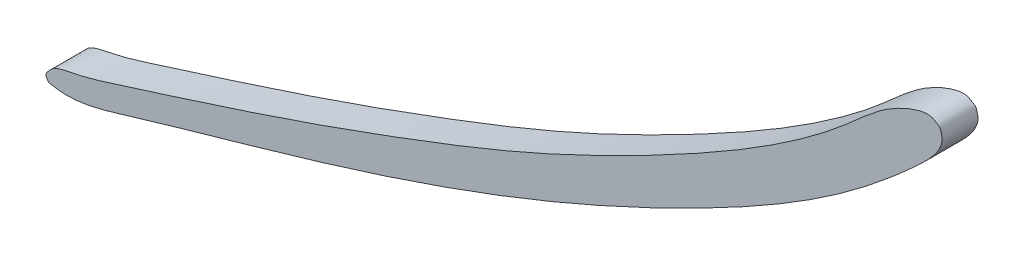
ISO-10303-21;
HEADER;
FILE_DESCRIPTION(('STEP AP214'),'2;1');
FILE_NAME('part.step','',(''),(''),'','','');
FILE_SCHEMA(('AUTOMOTIVE_DESIGN { 1 0 10303 214 1 1 1 1 }'));
ENDSEC;
DATA;
#1=APPLICATION_CONTEXT('core data for automotive mechanical design processes');
#2=APPLICATION_PROTOCOL_DEFINITION('international standard','automotive_design',2000,#1);
#3=PRODUCT_CONTEXT('',#1,'mechanical');
#4=PRODUCT('Part','Part','',(#3));
#5=PRODUCT_RELATED_PRODUCT_CATEGORY('part','',(#4));
#6=PRODUCT_DEFINITION_FORMATION('','',#4);
#7=PRODUCT_DEFINITION_CONTEXT('part definition',#1,'design');
#8=PRODUCT_DEFINITION('design','',#6,#7);
#9=PRODUCT_DEFINITION_SHAPE('','',#8);
#10=(LENGTH_UNIT() NAMED_UNIT(*) SI_UNIT(.MILLI.,.METRE.));
#11=(NAMED_UNIT(*) PLANE_ANGLE_UNIT() SI_UNIT($,.RADIAN.));
#12=(NAMED_UNIT(*) SI_UNIT($,.STERADIAN.) SOLID_ANGLE_UNIT());
#13=UNCERTAINTY_MEASURE_WITH_UNIT(LENGTH_MEASURE(1.E-05),#10,'distance_accuracy_value','');
#14=(GEOMETRIC_REPRESENTATION_CONTEXT(3) GLOBAL_UNCERTAINTY_ASSIGNED_CONTEXT((#13)) GLOBAL_UNIT_ASSIGNED_CONTEXT((#10,
#11,#12)) REPRESENTATION_CONTEXT('',''));
#15=CARTESIAN_POINT('',(0.,0.,0.));
#16=DIRECTION('',(0.,0.,1.));
#17=DIRECTION('',(1.,0.,0.));
#18=AXIS2_PLACEMENT_3D('',#15,#16,#17);
#19=CARTESIAN_POINT('',(100.856543420804,0.,172.));
#20=CARTESIAN_POINT('',(100.77983885836,0.126927841356701,172.));
#21=CARTESIAN_POINT('',(100.662596135674,0.21744927088755,172.));
#22=CARTESIAN_POINT('',(100.421790469726,0.383624526763214,172.));
#23=CARTESIAN_POINT('',(100.296402312574,0.458934114660203,172.));
#24=CARTESIAN_POINT('',(100.049023461196,0.614853969354855,172.));
#25=CARTESIAN_POINT('',(99.9267694917447,0.695053477457356,172.));
#26=CARTESIAN_POINT('',(99.6765463609155,0.846535723148802,172.));
#27=CARTESIAN_POINT('',(99.5487620730539,0.917895490540779,172.));
#28=CARTESIAN_POINT('',(99.2886789635635,1.04728674125018,172.));
#29=CARTESIAN_POINT('',(99.1560361495975,1.10534776351891,172.));
#30=CARTESIAN_POINT('',(98.8809264269111,1.19641310903551,172.));
#31=CARTESIAN_POINT('',(98.7377639809031,1.22998743975916,172.));
#32=CARTESIAN_POINT('',(98.3016755478108,1.29816745985561,172.));
#33=CARTESIAN_POINT('',(98.0112202649311,1.2999847946435,172.));
#34=CARTESIAN_POINT('',(97.4305761110491,1.2606173666907,172.));
#35=CARTESIAN_POINT('',(97.1395673937876,1.21817249886957,172.));
#36=CARTESIAN_POINT('',(96.5676742330208,1.11223534318413,172.));
#37=CARTESIAN_POINT('',(96.2852333542078,1.04816783547126,172.));
#38=CARTESIAN_POINT('',(95.4473326146076,0.826135912949858,172.));
#39=CARTESIAN_POINT('',(94.900682649969,0.640279671769097,172.));
#40=CARTESIAN_POINT('',(93.8187122240887,0.232698373667369,172.));
#41=CARTESIAN_POINT('',(93.2827796710361,0.00844900181067423,172.));
#42=CARTESIAN_POINT('',(92.2278809756486,-0.472778004879594,172.));
#43=CARTESIAN_POINT('',(91.7103982534995,-0.728216224010292,172.));
#44=CARTESIAN_POINT('',(90.1855364420016,-1.53556381374852,172.));
#45=CARTESIAN_POINT('',(89.2066960886628,-2.12992272240059,172.));
#46=CARTESIAN_POINT('',(86.3804827949016,-4.07707517051212,172.));
#47=CARTESIAN_POINT('',(84.635685343688,-5.58252853982007,172.));
#48=CARTESIAN_POINT('',(82.0405973767693,-7.87327891563485,172.));
#49=CARTESIAN_POINT('',(81.178136131406,-8.64064978052708,172.));
#50=CARTESIAN_POINT('',(79.4382099869104,-10.1532640842727,172.));
#51=CARTESIAN_POINT('',(78.562333619962,-10.9008502943569,172.));
#52=CARTESIAN_POINT('',(75.9036488131683,-13.0978078919392,172.));
#53=CARTESIAN_POINT('',(74.0887673014303,-14.4998778329317,172.));
#54=CARTESIAN_POINT('',(70.4019052464715,-17.2198079207241,172.));
#55=CARTESIAN_POINT('',(68.5302941006086,-18.5382128556698,172.));
#56=CARTESIAN_POINT('',(64.745535473302,-21.1137648341413,172.));
#57=CARTESIAN_POINT('',(62.8317535095197,-22.3699761415299,172.));
#58=CARTESIAN_POINT('',(58.961311457863,-24.8191619918406,172.));
#59=CARTESIAN_POINT('',(57.0051855637663,-26.0129243650796,172.));
#60=CARTESIAN_POINT('',(53.0599506005538,-28.3518054426891,172.));
#61=CARTESIAN_POINT('',(51.0709062628974,-29.4970196131776,172.));
#62=CARTESIAN_POINT('',(47.0691759951991,-31.7525812746772,172.));
#63=CARTESIAN_POINT('',(45.0563989372152,-32.8627943699723,172.));
#64=CARTESIAN_POINT('',(38.9869397525599,-36.1475259879528,172.));
#65=CARTESIAN_POINT('',(34.9066195148745,-38.2734468797464,172.));
#66=CARTESIAN_POINT('',(26.6933283867894,-42.420748304157,172.));
#67=CARTESIAN_POINT('',(22.5617900785755,-44.4421740908256,172.));
#68=CARTESIAN_POINT('',(14.2341294207928,-48.3495284796245,172.));
#69=CARTESIAN_POINT('',(10.034569942558,-50.2318401155177,172.));
#70=CARTESIAN_POINT('',(1.57274362956325,-53.8431132050577,172.));
#71=CARTESIAN_POINT('',(-2.6890656028401,-55.5730117480918,172.));
#72=CARTESIAN_POINT('',(-11.2524895661175,-58.935230458141,172.));
#73=CARTESIAN_POINT('',(-15.5526811976497,-60.5715134015785,172.));
#74=CARTESIAN_POINT('',(-24.1724292205344,-63.7885383240581,172.));
#75=CARTESIAN_POINT('',(-28.4927615227878,-65.3686277562354,172.));
#76=CARTESIAN_POINT('',(-37.1585268090143,-68.4605892207392,172.));
#77=CARTESIAN_POINT('',(-41.5043109674574,-69.9706392355688,172.));
#78=CARTESIAN_POINT('',(-50.2187989971696,-72.9209758741315,172.));
#79=CARTESIAN_POINT('',(-54.5878991316868,-74.3610321750858,172.));
#80=CARTESIAN_POINT('',(-63.3384737637215,-77.2044154913161,172.));
#81=CARTESIAN_POINT('',(-67.7190414878026,-78.6097886272033,172.));
#82=CARTESIAN_POINT('',(-74.2923394491335,-80.7101411200287,172.));
#83=CARTESIAN_POINT('',(-76.4837852629098,-81.4091905311203,172.));
#84=CARTESIAN_POINT('',(-79.773458558017,-82.4498366578601,172.));
#85=CARTESIAN_POINT('',(-80.8704840678304,-82.7952374708806,172.));
#86=CARTESIAN_POINT('',(-83.0654598348133,-83.4831106562946,172.));
#87=CARTESIAN_POINT('',(-84.1629267660121,-83.8271266427619,172.));
#88=CARTESIAN_POINT('',(-86.36080576115,-84.5054839944732,172.));
#89=CARTESIAN_POINT('',(-87.4627588707106,-84.836628874369,172.));
#90=CARTESIAN_POINT('',(-89.6829784218306,-85.4367179527009,172.));
#91=CARTESIAN_POINT('',(-90.7999423582826,-85.7069244861177,172.));
#92=CARTESIAN_POINT('',(-92.4893311495173,-86.0515371512056,172.));
#93=CARTESIAN_POINT('',(-93.0549086958018,-86.1557514583117,172.));
#94=CARTESIAN_POINT('',(-94.1795532459461,-86.3925222146707,172.));
#95=CARTESIAN_POINT('',(-94.738578298186,-86.5244105951381,172.));
#96=CARTESIAN_POINT('',(-95.5552079621578,-86.779341686343,172.));
#97=CARTESIAN_POINT('',(-95.8236516586031,-86.8745980779463,172.));
#98=CARTESIAN_POINT('',(-96.347212863121,-87.1014830695439,172.));
#99=CARTESIAN_POINT('',(-96.6023963878908,-87.2329314850023,172.));
#100=CARTESIAN_POINT('',(-97.0908861365222,-87.5555397446794,172.));
#101=CARTESIAN_POINT('',(-97.3114810718928,-87.74468270362,172.));
#102=CARTESIAN_POINT('',(-97.7213041323399,-88.1528329654133,172.));
#103=CARTESIAN_POINT('',(-97.9093399404686,-88.3753264754295,172.));
#104=CARTESIAN_POINT('',(-98.1864752330721,-88.711728587801,172.));
#105=CARTESIAN_POINT('',(-98.2770584005782,-88.8250772712571,172.));
#106=CARTESIAN_POINT('',(-98.3871844851467,-89.0125214256421,172.));
#107=CARTESIAN_POINT('',(-98.4193131751879,-89.0794865102643,172.));
#108=CARTESIAN_POINT('',(-98.460167408264,-89.2230837126458,172.));
#109=CARTESIAN_POINT('',(-98.4667686340422,-89.2966052326616,172.));
#110=CARTESIAN_POINT('',(-98.4538166377891,-89.5212516538809,172.));
#111=CARTESIAN_POINT('',(-98.4058583013105,-89.6626579631822,172.));
#112=CARTESIAN_POINT('',(-98.2966339069968,-89.9389777862737,172.));
#113=CARTESIAN_POINT('',(-98.2350210275931,-90.0738165211984,172.));
#114=CARTESIAN_POINT('',(-98.1207711695343,-90.2657180507491,172.));
#115=CARTESIAN_POINT('',(-98.078671132052,-90.3274764787191,172.));
#116=CARTESIAN_POINT('',(-97.980058965172,-90.4379793578246,172.));
#117=CARTESIAN_POINT('',(-97.9220968801729,-90.4871291047785,172.));
#118=CARTESIAN_POINT('',(-97.7964185123485,-90.5640088876879,172.));
#119=CARTESIAN_POINT('',(-97.7265363091708,-90.591756667024,172.));
#120=CARTESIAN_POINT('',(-97.5828080778681,-90.6305408846458,172.));
#121=CARTESIAN_POINT('',(-97.5098477574176,-90.6427513676444,172.));
#122=CARTESIAN_POINT('',(-97.289998696711,-90.6730404549556,172.));
#123=CARTESIAN_POINT('',(-97.1423368110166,-90.6860539097266,172.));
#124=CARTESIAN_POINT('',(-96.8489293796863,-90.7246354415787,172.));
#125=CARTESIAN_POINT('',(-96.7027204748316,-90.7477382350675,172.));
#126=CARTESIAN_POINT('',(-96.2642847930418,-90.8198036160037,172.));
#127=CARTESIAN_POINT('',(-95.9726900939061,-90.8742549280871,172.));
#128=CARTESIAN_POINT('',(-95.3872895448808,-90.9627934333528,172.));
#129=CARTESIAN_POINT('',(-95.0933193978028,-90.9953674924936,172.));
#130=CARTESIAN_POINT('',(-94.2072367458304,-91.0546647025516,172.));
#131=CARTESIAN_POINT('',(-93.6101319421302,-91.0500214791982,172.));
#132=CARTESIAN_POINT('',(-91.8385135306456,-90.9707956887102,172.));
#133=CARTESIAN_POINT('',(-90.6717710070555,-90.8327994555893,172.));
#134=CARTESIAN_POINT('',(-88.3599277860463,-90.4282232634365,172.));
#135=CARTESIAN_POINT('',(-87.2145358890098,-90.1633734509969,172.));
#136=CARTESIAN_POINT('',(-84.9328730914743,-89.5794819243088,172.));
#137=CARTESIAN_POINT('',(-83.7966365719679,-89.2596445463997,172.));
#138=CARTESIAN_POINT('',(-81.5319493950708,-88.5999771944273,172.));
#139=CARTESIAN_POINT('',(-80.4021807142297,-88.2612673259571,172.));
#140=CARTESIAN_POINT('',(-77.0145214209747,-87.2396908551562,172.));
#141=CARTESIAN_POINT('',(-74.7567092688941,-86.5565462488582,172.));
#142=CARTESIAN_POINT('',(-67.9720203461225,-84.5446631578214,172.));
#143=CARTESIAN_POINT('',(-63.4356457254034,-83.248492896838,172.));
#144=CARTESIAN_POINT('',(-54.3617736826654,-80.6608781374154,172.));
#145=CARTESIAN_POINT('',(-49.8256178477419,-79.364464248058,172.));
#146=CARTESIAN_POINT('',(-40.7715594051364,-76.7111070336863,172.));
#147=CARTESIAN_POINT('',(-36.2538303149443,-75.3535796109618,172.));
#148=CARTESIAN_POINT('',(-27.2450983475528,-72.5498731105162,172.));
#149=CARTESIAN_POINT('',(-22.753477656019,-71.103238704407,172.));
#150=CARTESIAN_POINT('',(-9.33349746074462,-66.6025459767798,172.));
#151=CARTESIAN_POINT('',(-0.456820427425578,-63.3911491088307,172.));
#152=CARTESIAN_POINT('',(12.6964705919893,-58.163149516341,172.));
#153=CARTESIAN_POINT('',(17.0538264799695,-56.3506513026726,172.));
#154=CARTESIAN_POINT('',(25.7073968536784,-52.5896638052076,172.));
#155=CARTESIAN_POINT('',(30.0076670224996,-50.6400486133682,172.));
#156=CARTESIAN_POINT('',(38.5345716564426,-46.6229367464093,172.));
#157=CARTESIAN_POINT('',(42.7614889583431,-44.5543933917274,172.));
#158=CARTESIAN_POINT('',(51.1361943392228,-40.2873831551504,172.));
#159=CARTESIAN_POINT('',(55.2839338660101,-38.088836554641,172.));
#160=CARTESIAN_POINT('',(63.4656557699483,-33.5049636838512,172.));
#161=CARTESIAN_POINT('',(67.4990851364591,-31.1187294166223,172.));
#162=CARTESIAN_POINT('',(73.4170985682878,-27.322430656744,172.));
#163=CARTESIAN_POINT('',(75.3679832779662,-26.0212262445274,172.));
#164=CARTESIAN_POINT('',(79.2185021969817,-23.3346684100329,172.));
#165=CARTESIAN_POINT('',(81.1182435517368,-21.9494909115173,172.));
#166=CARTESIAN_POINT('',(84.8646231977585,-19.0919451515858,172.));
#167=CARTESIAN_POINT('',(86.7107167736463,-17.6186825133422,172.));
#168=CARTESIAN_POINT('',(90.3520541465883,-14.5886661777982,172.));
#169=CARTESIAN_POINT('',(92.1499737872909,-13.0331791528142,172.));
#170=CARTESIAN_POINT('',(94.8093381621318,-10.6486657987046,172.));
#171=CARTESIAN_POINT('',(95.6887119453332,-9.84610202374555,172.));
#172=CARTESIAN_POINT('',(96.9831445984803,-8.61538506780622,172.));
#173=CARTESIAN_POINT('',(97.4093334616404,-8.1997336034311,172.));
#174=CARTESIAN_POINT('',(98.2421711845027,-7.34960638315117,172.));
#175=CARTESIAN_POINT('',(98.6509731022217,-6.91536267436171,172.));
#176=CARTESIAN_POINT('',(99.4271449367283,-6.01444788974341,172.));
#177=CARTESIAN_POINT('',(99.7922167265819,-5.54943084390589,172.));
#178=CARTESIAN_POINT('',(100.444980677453,-4.57044331739285,172.));
#179=CARTESIAN_POINT('',(100.731185350281,-4.05553179244992,172.));
#180=CARTESIAN_POINT('',(101.062165320074,-3.22095890401529,172.));
#181=CARTESIAN_POINT('',(101.15725649884,-2.93148351149039,172.));
#182=CARTESIAN_POINT('',(101.252048262309,-2.49222230683909,172.));
#183=CARTESIAN_POINT('',(101.275822311795,-2.34436724614934,172.));
#184=CARTESIAN_POINT('',(101.302648834185,-2.04485709662109,172.));
#185=CARTESIAN_POINT('',(101.305899922283,-1.89144068378369,172.));
#186=CARTESIAN_POINT('',(101.271116640166,-1.44062753039793,172.));
#187=CARTESIAN_POINT('',(101.186022267309,-1.15250400234579,172.));
#188=CARTESIAN_POINT('',(101.063157796737,-0.719360401016924,172.));
#189=CARTESIAN_POINT('',(101.028127818769,-0.573725909855597,172.));
#190=CARTESIAN_POINT('',(100.978823143589,-0.354202821004623,172.));
#191=CARTESIAN_POINT('',(100.963051802283,-0.280835391985103,172.));
#192=CARTESIAN_POINT('',(100.932361585353,-0.172830623827274,172.));
#193=CARTESIAN_POINT('',(100.920807627865,-0.137214230953743,172.));
#194=CARTESIAN_POINT('',(100.892909130398,-0.0673753090366209,172.));
#195=CARTESIAN_POINT('',(100.875719561416,-0.0317319603391646,172.));
#196=CARTESIAN_POINT('',(100.856543420804,0.,172.));
#197=B_SPLINE_CURVE_WITH_KNOTS('',3,(#19,#20,#21,#22,#23,#24,#25,#26,#27,#28,#29,#30,#31,#32,
#33,#34,#35,#36,#37,#38,#39,#40,#41,#42,#43,#44,#45,#46,#47,#48,#49,#50,#51,#52,#53,#54,#55,#56,
#57,#58,#59,#60,#61,#62,#63,#64,#65,#66,#67,#68,#69,#70,#71,#72,#73,#74,#75,#76,#77,#78,#79,#80,
#81,#82,#83,#84,#85,#86,#87,#88,#89,#90,#91,#92,#93,#94,#95,#96,#97,#98,#99,#100,#101,#102,#103,
#104,#105,#106,#107,#108,#109,#110,#111,#112,#113,#114,#115,#116,#117,#118,#119,#120,#121,#122,
#123,#124,#125,#126,#127,#128,#129,#130,#131,#132,#133,#134,#135,#136,#137,#138,#139,#140,#141,
#142,#143,#144,#145,#146,#147,#148,#149,#150,#151,#152,#153,#154,#155,#156,#157,#158,#159,#160,
#161,#162,#163,#164,#165,#166,#167,#168,#169,#170,#171,#172,#173,#174,#175,#176,#177,#178,#179,
#180,#181,#182,#183,#184,#185,#186,#187,#188,#189,#190,#191,#192,#193,#194,#195,#196),
.UNSPECIFIED.,.T.,.F.,(4,2,2,2,2,2,2,2,2,2,2,2,2,2,2,2,2,2,2,2,2,2,2,2,2,2,2,2,2,2,2,2,2,2,2,2,
2,2,2,2,2,2,2,2,2,2,2,2,2,2,2,2,2,2,2,2,2,2,2,2,2,2,2,2,2,2,2,2,2,2,2,2,2,2,2,2,2,2,2,2,2,2,2,2,
2,2,2,2,4),(0.,0.000976562499999959,0.00195312499999992,0.00292968749999988,0.00390624999999984,
0.0048828124999998,0.00585937499999976,0.00781249999999977,0.00976562499999977,
0.0117187499999998,0.0156249999999998,0.0195312499999998,0.0234374999999998,0.03125,
0.0468750000000003,0.0546875000000005,0.0625000000000006,0.0781250000000008,0.0937500000000011,
0.109375000000001,0.125000000000001,0.140625000000002,0.156250000000002,0.187500000000002,
0.218750000000003,0.250000000000003,0.281250000000003,0.312500000000004,0.343750000000004,
0.375000000000005,0.406250000000005,0.437500000000005,0.453125000000006,0.460937500000006,
0.468750000000006,0.476562500000006,0.484375000000006,0.488281250000006,0.492187500000006,
0.494140625000006,0.496093750000006,0.498046875000006,0.500000000000006,0.500976562500006,
0.501464843750006,0.501953125000006,0.502929687500006,0.503906250000006,0.504394531250006,
0.504882812500006,0.505371093750006,0.505859375000007,0.506835937500006,0.507812500000006,
0.509765625000006,0.511718750000007,0.515625000000006,0.523437500000006,0.531250000000006,
0.539062500000006,0.546875000000006,0.562500000000006,0.593750000000005,0.625000000000005,
0.656250000000005,0.687500000000004,0.750000000000003,0.781250000000003,0.812500000000003,
0.843750000000002,0.875000000000002,0.906250000000001,0.921875000000001,0.937500000000001,
0.953125000000001,0.968750000000001,0.9765625,0.98046875,0.984375,0.98828125,0.9921875,
0.994140625,0.9951171875,0.99609375,0.998046875,0.9990234375,0.99951171875,0.999755859375,1.),.UNSPECIFIED.);
#198=DIRECTION('',(0.,0.,-1.));
#199=VECTOR('',#198,1.);
#200=SURFACE_OF_LINEAR_EXTRUSION('',#197,#199);
#201=CARTESIAN_POINT('',(100.856543420804,0.,172.));
#202=CARTESIAN_POINT('',(100.875719561416,-0.0317319603391646,172.));
#203=CARTESIAN_POINT('',(100.892909130398,-0.0673753090366209,172.));
#204=CARTESIAN_POINT('',(100.920807627865,-0.137214230953743,172.));
#205=CARTESIAN_POINT('',(100.932361585353,-0.172830623827274,172.));
#206=CARTESIAN_POINT('',(100.963051802283,-0.280835391985103,172.));
#207=CARTESIAN_POINT('',(100.978823143589,-0.354202821004623,172.));
#208=CARTESIAN_POINT('',(101.028127818769,-0.573725909855597,172.));
#209=CARTESIAN_POINT('',(101.063157796737,-0.719360401016924,172.));
#210=CARTESIAN_POINT('',(101.186022267309,-1.15250400234579,172.));
#211=CARTESIAN_POINT('',(101.271116640166,-1.44062753039793,172.));
#212=CARTESIAN_POINT('',(101.305899922283,-1.89144068378369,172.));
#213=CARTESIAN_POINT('',(101.302648834185,-2.04485709662109,172.));
#214=CARTESIAN_POINT('',(101.275822311795,-2.34436724614934,172.));
#215=CARTESIAN_POINT('',(101.252048262309,-2.49222230683909,172.));
#216=CARTESIAN_POINT('',(101.15725649884,-2.93148351149039,172.));
#217=CARTESIAN_POINT('',(101.062165320074,-3.22095890401529,172.));
#218=CARTESIAN_POINT('',(100.731185350281,-4.05553179244992,172.));
#219=CARTESIAN_POINT('',(100.444980677453,-4.57044331739285,172.));
#220=CARTESIAN_POINT('',(99.7922167265819,-5.54943084390589,172.));
#221=CARTESIAN_POINT('',(99.4271449367283,-6.01444788974341,172.));
#222=CARTESIAN_POINT('',(98.6509731022217,-6.91536267436171,172.));
#223=CARTESIAN_POINT('',(98.2421711845027,-7.34960638315117,172.));
#224=CARTESIAN_POINT('',(97.4093334616404,-8.1997336034311,172.));
#225=CARTESIAN_POINT('',(96.9831445984803,-8.61538506780622,172.));
#226=CARTESIAN_POINT('',(95.6887119453332,-9.84610202374555,172.));
#227=CARTESIAN_POINT('',(94.8093381621318,-10.6486657987046,172.));
#228=CARTESIAN_POINT('',(92.1499737872909,-13.0331791528142,172.));
#229=CARTESIAN_POINT('',(90.3520541465883,-14.5886661777982,172.));
#230=CARTESIAN_POINT('',(86.7107167736463,-17.6186825133422,172.));
#231=CARTESIAN_POINT('',(84.8646231977585,-19.0919451515858,172.));
#232=CARTESIAN_POINT('',(81.1182435517368,-21.9494909115173,172.));
#233=CARTESIAN_POINT('',(79.2185021969817,-23.3346684100329,172.));
#234=CARTESIAN_POINT('',(75.3679832779662,-26.0212262445274,172.));
#235=CARTESIAN_POINT('',(73.4170985682878,-27.322430656744,172.));
#236=CARTESIAN_POINT('',(67.4990851364591,-31.1187294166223,172.));
#237=CARTESIAN_POINT('',(63.4656557699483,-33.5049636838512,172.));
#238=CARTESIAN_POINT('',(55.2839338660101,-38.088836554641,172.));
#239=CARTESIAN_POINT('',(51.1361943392228,-40.2873831551504,172.));
#240=CARTESIAN_POINT('',(42.7614889583431,-44.5543933917274,172.));
#241=CARTESIAN_POINT('',(38.5345716564426,-46.6229367464093,172.));
#242=CARTESIAN_POINT('',(30.0076670224996,-50.6400486133682,172.));
#243=CARTESIAN_POINT('',(25.7073968536784,-52.5896638052076,172.));
#244=CARTESIAN_POINT('',(17.0538264799695,-56.3506513026726,172.));
#245=CARTESIAN_POINT('',(12.6964705919893,-58.163149516341,172.));
#246=CARTESIAN_POINT('',(-0.456820427425578,-63.3911491088307,172.));
#247=CARTESIAN_POINT('',(-9.33349746074462,-66.6025459767798,172.));
#248=CARTESIAN_POINT('',(-22.753477656019,-71.103238704407,172.));
#249=CARTESIAN_POINT('',(-27.2450983475528,-72.5498731105162,172.));
#250=CARTESIAN_POINT('',(-36.2538303149443,-75.3535796109618,172.));
#251=CARTESIAN_POINT('',(-40.7715594051364,-76.7111070336863,172.));
#252=CARTESIAN_POINT('',(-49.8256178477419,-79.364464248058,172.));
#253=CARTESIAN_POINT('',(-54.3617736826654,-80.6608781374154,172.));
#254=CARTESIAN_POINT('',(-63.4356457254034,-83.248492896838,172.));
#255=CARTESIAN_POINT('',(-67.9720203461225,-84.5446631578214,172.));
#256=CARTESIAN_POINT('',(-74.7567092688941,-86.5565462488582,172.));
#257=CARTESIAN_POINT('',(-77.0145214209747,-87.2396908551562,172.));
#258=CARTESIAN_POINT('',(-80.4021807142297,-88.2612673259571,172.));
#259=CARTESIAN_POINT('',(-81.5319493950708,-88.5999771944273,172.));
#260=CARTESIAN_POINT('',(-83.7966365719679,-89.2596445463997,172.));
#261=CARTESIAN_POINT('',(-84.9328730914743,-89.5794819243088,172.));
#262=CARTESIAN_POINT('',(-87.2145358890098,-90.1633734509969,172.));
#263=CARTESIAN_POINT('',(-88.3599277860463,-90.4282232634365,172.));
#264=CARTESIAN_POINT('',(-90.6717710070555,-90.8327994555893,172.));
#265=CARTESIAN_POINT('',(-91.8385135306456,-90.9707956887102,172.));
#266=CARTESIAN_POINT('',(-93.6101319421302,-91.0500214791982,172.));
#267=CARTESIAN_POINT('',(-94.2072367458304,-91.0546647025516,172.));
#268=CARTESIAN_POINT('',(-95.0933193978028,-90.9953674924936,172.));
#269=CARTESIAN_POINT('',(-95.3872895448808,-90.9627934333528,172.));
#270=CARTESIAN_POINT('',(-95.9726900939061,-90.8742549280871,172.));
#271=CARTESIAN_POINT('',(-96.2642847930418,-90.8198036160037,172.));
#272=CARTESIAN_POINT('',(-96.7027204748316,-90.7477382350675,172.));
#273=CARTESIAN_POINT('',(-96.8489293796863,-90.7246354415787,172.));
#274=CARTESIAN_POINT('',(-97.1423368110166,-90.6860539097266,172.));
#275=CARTESIAN_POINT('',(-97.289998696711,-90.6730404549556,172.));
#276=CARTESIAN_POINT('',(-97.5098477574176,-90.6427513676444,172.));
#277=CARTESIAN_POINT('',(-97.5828080778681,-90.6305408846458,172.));
#278=CARTESIAN_POINT('',(-97.7265363091708,-90.591756667024,172.));
#279=CARTESIAN_POINT('',(-97.7964185123485,-90.5640088876879,172.));
#280=CARTESIAN_POINT('',(-97.9220968801729,-90.4871291047785,172.));
#281=CARTESIAN_POINT('',(-97.980058965172,-90.4379793578246,172.));
#282=CARTESIAN_POINT('',(-98.078671132052,-90.3274764787191,172.));
#283=CARTESIAN_POINT('',(-98.1207711695343,-90.2657180507491,172.));
#284=CARTESIAN_POINT('',(-98.2350210275931,-90.0738165211984,172.));
#285=CARTESIAN_POINT('',(-98.2966339069968,-89.9389777862737,172.));
#286=CARTESIAN_POINT('',(-98.4058583013105,-89.6626579631822,172.));
#287=CARTESIAN_POINT('',(-98.4538166377891,-89.5212516538809,172.));
#288=CARTESIAN_POINT('',(-98.4667686340422,-89.2966052326616,172.));
#289=CARTESIAN_POINT('',(-98.460167408264,-89.2230837126458,172.));
#290=CARTESIAN_POINT('',(-98.4193131751879,-89.0794865102643,172.));
#291=CARTESIAN_POINT('',(-98.3871844851467,-89.0125214256421,172.));
#292=CARTESIAN_POINT('',(-98.2770584005782,-88.8250772712571,172.));
#293=CARTESIAN_POINT('',(-98.1864752330721,-88.711728587801,172.));
#294=CARTESIAN_POINT('',(-97.9093399404686,-88.3753264754295,172.));
#295=CARTESIAN_POINT('',(-97.7213041323399,-88.1528329654133,172.));
#296=CARTESIAN_POINT('',(-97.3114810718928,-87.74468270362,172.));
#297=CARTESIAN_POINT('',(-97.0908861365222,-87.5555397446794,172.));
#298=CARTESIAN_POINT('',(-96.6023963878908,-87.2329314850023,172.));
#299=CARTESIAN_POINT('',(-96.347212863121,-87.1014830695439,172.));
#300=CARTESIAN_POINT('',(-95.8236516586031,-86.8745980779463,172.));
#301=CARTESIAN_POINT('',(-95.5552079621578,-86.779341686343,172.));
#302=CARTESIAN_POINT('',(-94.738578298186,-86.5244105951381,172.));
#303=CARTESIAN_POINT('',(-94.1795532459461,-86.3925222146707,172.));
#304=CARTESIAN_POINT('',(-93.0549086958018,-86.1557514583117,172.));
#305=CARTESIAN_POINT('',(-92.4893311495173,-86.0515371512056,172.));
#306=CARTESIAN_POINT('',(-90.7999423582826,-85.7069244861177,172.));
#307=CARTESIAN_POINT('',(-89.6829784218306,-85.4367179527009,172.));
#308=CARTESIAN_POINT('',(-87.4627588707106,-84.836628874369,172.));
#309=CARTESIAN_POINT('',(-86.36080576115,-84.5054839944732,172.));
#310=CARTESIAN_POINT('',(-84.1629267660121,-83.8271266427619,172.));
#311=CARTESIAN_POINT('',(-83.0654598348133,-83.4831106562946,172.));
#312=CARTESIAN_POINT('',(-80.8704840678304,-82.7952374708806,172.));
#313=CARTESIAN_POINT('',(-79.773458558017,-82.4498366578601,172.));
#314=CARTESIAN_POINT('',(-76.4837852629098,-81.4091905311203,172.));
#315=CARTESIAN_POINT('',(-74.2923394491335,-80.7101411200287,172.));
#316=CARTESIAN_POINT('',(-67.7190414878026,-78.6097886272033,172.));
#317=CARTESIAN_POINT('',(-63.3384737637215,-77.2044154913161,172.));
#318=CARTESIAN_POINT('',(-54.5878991316868,-74.3610321750858,172.));
#319=CARTESIAN_POINT('',(-50.2187989971696,-72.9209758741315,172.));
#320=CARTESIAN_POINT('',(-41.5043109674574,-69.9706392355688,172.));
#321=CARTESIAN_POINT('',(-37.1585268090143,-68.4605892207392,172.));
#322=CARTESIAN_POINT('',(-28.4927615227878,-65.3686277562354,172.));
#323=CARTESIAN_POINT('',(-24.1724292205344,-63.7885383240581,172.));
#324=CARTESIAN_POINT('',(-15.5526811976497,-60.5715134015785,172.));
#325=CARTESIAN_POINT('',(-11.2524895661175,-58.935230458141,172.));
#326=CARTESIAN_POINT('',(-2.6890656028401,-55.5730117480918,172.));
#327=CARTESIAN_POINT('',(1.57274362956325,-53.8431132050577,172.));
#328=CARTESIAN_POINT('',(10.034569942558,-50.2318401155177,172.));
#329=CARTESIAN_POINT('',(14.2341294207928,-48.3495284796245,172.));
#330=CARTESIAN_POINT('',(22.5617900785755,-44.4421740908256,172.));
#331=CARTESIAN_POINT('',(26.6933283867894,-42.420748304157,172.));
#332=CARTESIAN_POINT('',(34.9066195148745,-38.2734468797464,172.));
#333=CARTESIAN_POINT('',(38.9869397525599,-36.1475259879528,172.));
#334=CARTESIAN_POINT('',(45.0563989372152,-32.8627943699723,172.));
#335=CARTESIAN_POINT('',(47.0691759951991,-31.7525812746772,172.));
#336=CARTESIAN_POINT('',(51.0709062628974,-29.4970196131776,172.));
#337=CARTESIAN_POINT('',(53.0599506005538,-28.3518054426891,172.));
#338=CARTESIAN_POINT('',(57.0051855637663,-26.0129243650796,172.));
#339=CARTESIAN_POINT('',(58.961311457863,-24.8191619918406,172.));
#340=CARTESIAN_POINT('',(62.8317535095197,-22.3699761415299,172.));
#341=CARTESIAN_POINT('',(64.745535473302,-21.1137648341413,172.));
#342=CARTESIAN_POINT('',(68.5302941006086,-18.5382128556698,172.));
#343=CARTESIAN_POINT('',(70.4019052464715,-17.2198079207241,172.));
#344=CARTESIAN_POINT('',(74.0887673014303,-14.4998778329317,172.));
#345=CARTESIAN_POINT('',(75.9036488131683,-13.0978078919392,172.));
#346=CARTESIAN_POINT('',(78.562333619962,-10.9008502943569,172.));
#347=CARTESIAN_POINT('',(79.4382099869104,-10.1532640842727,172.));
#348=CARTESIAN_POINT('',(81.178136131406,-8.64064978052708,172.));
#349=CARTESIAN_POINT('',(82.0405973767693,-7.87327891563485,172.));
#350=CARTESIAN_POINT('',(84.635685343688,-5.58252853982007,172.));
#351=CARTESIAN_POINT('',(86.3804827949016,-4.07707517051212,172.));
#352=CARTESIAN_POINT('',(89.2066960886628,-2.12992272240059,172.));
#353=CARTESIAN_POINT('',(90.1855364420016,-1.53556381374852,172.));
#354=CARTESIAN_POINT('',(91.7103982534995,-0.728216224010292,172.));
#355=CARTESIAN_POINT('',(92.2278809756486,-0.472778004879594,172.));
#356=CARTESIAN_POINT('',(93.2827796710361,0.00844900181067423,172.));
#357=CARTESIAN_POINT('',(93.8187122240887,0.232698373667369,172.));
#358=CARTESIAN_POINT('',(94.900682649969,0.640279671769097,172.));
#359=CARTESIAN_POINT('',(95.4473326146076,0.826135912949858,172.));
#360=CARTESIAN_POINT('',(96.2852333542078,1.04816783547126,172.));
#361=CARTESIAN_POINT('',(96.5676742330208,1.11223534318413,172.));
#362=CARTESIAN_POINT('',(97.1395673937876,1.21817249886957,172.));
#363=CARTESIAN_POINT('',(97.4305761110491,1.2606173666907,172.));
#364=CARTESIAN_POINT('',(98.0112202649311,1.2999847946435,172.));
#365=CARTESIAN_POINT('',(98.3016755478108,1.29816745985561,172.));
#366=CARTESIAN_POINT('',(98.7377639809031,1.22998743975916,172.));
#367=CARTESIAN_POINT('',(98.8809264269111,1.19641310903551,172.));
#368=CARTESIAN_POINT('',(99.1560361495975,1.10534776351891,172.));
#369=CARTESIAN_POINT('',(99.2886789635635,1.04728674125018,172.));
#370=CARTESIAN_POINT('',(99.5487620730539,0.917895490540779,172.));
#371=CARTESIAN_POINT('',(99.6765463609155,0.846535723148802,172.));
#372=CARTESIAN_POINT('',(99.9267694917447,0.695053477457356,172.));
#373=CARTESIAN_POINT('',(100.049023461196,0.614853969354855,172.));
#374=CARTESIAN_POINT('',(100.296402312574,0.458934114660203,172.));
#375=CARTESIAN_POINT('',(100.421790469726,0.383624526763214,172.));
#376=CARTESIAN_POINT('',(100.662596135674,0.21744927088755,172.));
#377=CARTESIAN_POINT('',(100.77983885836,0.126927841356701,172.));
#378=CARTESIAN_POINT('',(100.856543420804,0.,172.));
#379=B_SPLINE_CURVE_WITH_KNOTS('',3,(#201,#202,#203,#204,#205,#206,#207,#208,#209,#210,#211,
#212,#213,#214,#215,#216,#217,#218,#219,#220,#221,#222,#223,#224,#225,#226,#227,#228,#229,#230,
#231,#232,#233,#234,#235,#236,#237,#238,#239,#240,#241,#242,#243,#244,#245,#246,#247,#248,#249,
#250,#251,#252,#253,#254,#255,#256,#257,#258,#259,#260,#261,#262,#263,#264,#265,#266,#267,#268,
#269,#270,#271,#272,#273,#274,#275,#276,#277,#278,#279,#280,#281,#282,#283,#284,#285,#286,#287,
#288,#289,#290,#291,#292,#293,#294,#295,#296,#297,#298,#299,#300,#301,#302,#303,#304,#305,#306,
#307,#308,#309,#310,#311,#312,#313,#314,#315,#316,#317,#318,#319,#320,#321,#322,#323,#324,#325,
#326,#327,#328,#329,#330,#331,#332,#333,#334,#335,#336,#337,#338,#339,#340,#341,#342,#343,#344,
#345,#346,#347,#348,#349,#350,#351,#352,#353,#354,#355,#356,#357,#358,#359,#360,#361,#362,#363,
#364,#365,#366,#367,#368,#369,#370,#371,#372,#373,#374,#375,#376,#377,#378),.UNSPECIFIED.,.T.,
.F.,(4,2,2,2,2,2,2,2,2,2,2,2,2,2,2,2,2,2,2,2,2,2,2,2,2,2,2,2,2,2,2,2,2,2,2,2,2,2,2,2,2,2,2,2,2,
2,2,2,2,2,2,2,2,2,2,2,2,2,2,2,2,2,2,2,2,2,2,2,2,2,2,2,2,2,2,2,2,2,2,2,2,2,2,2,2,2,2,2,4),(0.,
0.000244140625,0.00048828125,0.0009765625,0.00195312499999989,0.00390624999999989,
0.00488281249999978,0.00585937499999978,0.00781249999999978,0.0117187499999998,
0.0156249999999997,0.0195312499999997,0.0234374999999996,0.0312499999999994,0.0468749999999992,
0.0624999999999991,0.0781249999999989,0.0937499999999987,0.124999999999998,0.156249999999998,
0.187499999999997,0.218749999999997,0.249999999999997,0.312499999999996,0.343749999999995,
0.374999999999995,0.406249999999995,0.437499999999994,0.453124999999994,0.460937499999994,
0.468749999999994,0.476562499999994,0.484374999999994,0.488281249999993,0.490234374999994,
0.492187499999994,0.493164062499994,0.494140624999993,0.494628906249994,0.495117187499994,
0.495605468749994,0.496093749999994,0.497070312499994,0.498046874999994,0.498535156249994,
0.499023437499994,0.499999999999994,0.501953124999994,0.503906249999994,0.505859374999994,
0.507812499999994,0.511718749999994,0.515624999999994,0.523437499999994,0.531249999999994,
0.539062499999994,0.546874999999994,0.562499999999995,0.593749999999995,0.624999999999995,
0.656249999999996,0.687499999999996,0.718749999999996,0.749999999999997,0.781249999999997,
0.812499999999998,0.843749999999998,0.859374999999998,0.874999999999998,0.890624999999999,
0.906249999999999,0.921874999999999,0.937499999999999,0.9453125,0.953125,0.96875,0.9765625,
0.98046875,0.984375,0.98828125,0.990234375,0.9921875,0.994140625,0.9951171875,0.99609375,
0.9970703125,0.998046875,0.9990234375,1.),.UNSPECIFIED.);
#380=CARTESIAN_POINT('',(100.856543420804,0.,172.));
#381=VERTEX_POINT('',#380);
#382=EDGE_CURVE('E10',#381,#381,#379,.F.);
#383=ORIENTED_EDGE('',*,*,#382,.F.);
#384=EDGE_LOOP('',(#383));
#385=FACE_BOUND('',#384,.T.);
#386=CARTESIAN_POINT('',(100.856543420804,0.,164.));
#387=CARTESIAN_POINT('',(100.77983885836,0.126927841356701,164.));
#388=CARTESIAN_POINT('',(100.662596135674,0.21744927088755,164.));
#389=CARTESIAN_POINT('',(100.421790469726,0.383624526763214,164.));
#390=CARTESIAN_POINT('',(100.296402312574,0.458934114660203,164.));
#391=CARTESIAN_POINT('',(100.049023461196,0.614853969354855,164.));
#392=CARTESIAN_POINT('',(99.9267694917447,0.695053477457356,164.));
#393=CARTESIAN_POINT('',(99.6765463609155,0.846535723148802,164.));
#394=CARTESIAN_POINT('',(99.5487620730539,0.917895490540779,164.));
#395=CARTESIAN_POINT('',(99.2886789635635,1.04728674125018,164.));
#396=CARTESIAN_POINT('',(99.1560361495975,1.10534776351891,164.));
#397=CARTESIAN_POINT('',(98.8809264269111,1.19641310903551,164.));
#398=CARTESIAN_POINT('',(98.7377639809031,1.22998743975916,164.));
#399=CARTESIAN_POINT('',(98.3016755478108,1.29816745985561,164.));
#400=CARTESIAN_POINT('',(98.0112202649311,1.2999847946435,164.));
#401=CARTESIAN_POINT('',(97.4305761110491,1.2606173666907,164.));
#402=CARTESIAN_POINT('',(97.1395673937876,1.21817249886957,164.));
#403=CARTESIAN_POINT('',(96.5676742330208,1.11223534318413,164.));
#404=CARTESIAN_POINT('',(96.2852333542078,1.04816783547126,164.));
#405=CARTESIAN_POINT('',(95.4473326146076,0.826135912949858,164.));
#406=CARTESIAN_POINT('',(94.900682649969,0.640279671769097,164.));
#407=CARTESIAN_POINT('',(93.8187122240887,0.232698373667369,164.));
#408=CARTESIAN_POINT('',(93.2827796710361,0.00844900181067423,164.));
#409=CARTESIAN_POINT('',(92.2278809756486,-0.472778004879594,164.));
#410=CARTESIAN_POINT('',(91.7103982534995,-0.728216224010292,164.));
#411=CARTESIAN_POINT('',(90.1855364420016,-1.53556381374852,164.));
#412=CARTESIAN_POINT('',(89.2066960886628,-2.12992272240059,164.));
#413=CARTESIAN_POINT('',(86.3804827949016,-4.07707517051212,164.));
#414=CARTESIAN_POINT('',(84.635685343688,-5.58252853982007,164.));
#415=CARTESIAN_POINT('',(82.0405973767693,-7.87327891563485,164.));
#416=CARTESIAN_POINT('',(81.178136131406,-8.64064978052708,164.));
#417=CARTESIAN_POINT('',(79.4382099869104,-10.1532640842727,164.));
#418=CARTESIAN_POINT('',(78.562333619962,-10.9008502943569,164.));
#419=CARTESIAN_POINT('',(75.9036488131683,-13.0978078919392,164.));
#420=CARTESIAN_POINT('',(74.0887673014303,-14.4998778329317,164.));
#421=CARTESIAN_POINT('',(70.4019052464715,-17.2198079207241,164.));
#422=CARTESIAN_POINT('',(68.5302941006086,-18.5382128556698,164.));
#423=CARTESIAN_POINT('',(64.745535473302,-21.1137648341413,164.));
#424=CARTESIAN_POINT('',(62.8317535095197,-22.3699761415299,164.));
#425=CARTESIAN_POINT('',(58.961311457863,-24.8191619918406,164.));
#426=CARTESIAN_POINT('',(57.0051855637663,-26.0129243650796,164.));
#427=CARTESIAN_POINT('',(53.0599506005538,-28.3518054426891,164.));
#428=CARTESIAN_POINT('',(51.0709062628974,-29.4970196131776,164.));
#429=CARTESIAN_POINT('',(47.0691759951991,-31.7525812746772,164.));
#430=CARTESIAN_POINT('',(45.0563989372152,-32.8627943699723,164.));
#431=CARTESIAN_POINT('',(38.9869397525599,-36.1475259879528,164.));
#432=CARTESIAN_POINT('',(34.9066195148745,-38.2734468797464,164.));
#433=CARTESIAN_POINT('',(26.6933283867894,-42.420748304157,164.));
#434=CARTESIAN_POINT('',(22.5617900785755,-44.4421740908256,164.));
#435=CARTESIAN_POINT('',(14.2341294207928,-48.3495284796245,164.));
#436=CARTESIAN_POINT('',(10.034569942558,-50.2318401155177,164.));
#437=CARTESIAN_POINT('',(1.57274362956325,-53.8431132050577,164.));
#438=CARTESIAN_POINT('',(-2.6890656028401,-55.5730117480918,164.));
#439=CARTESIAN_POINT('',(-11.2524895661175,-58.935230458141,164.));
#440=CARTESIAN_POINT('',(-15.5526811976497,-60.5715134015785,164.));
#441=CARTESIAN_POINT('',(-24.1724292205344,-63.7885383240581,164.));
#442=CARTESIAN_POINT('',(-28.4927615227878,-65.3686277562354,164.));
#443=CARTESIAN_POINT('',(-37.1585268090143,-68.4605892207392,164.));
#444=CARTESIAN_POINT('',(-41.5043109674574,-69.9706392355688,164.));
#445=CARTESIAN_POINT('',(-50.2187989971696,-72.9209758741315,164.));
#446=CARTESIAN_POINT('',(-54.5878991316868,-74.3610321750858,164.));
#447=CARTESIAN_POINT('',(-63.3384737637215,-77.2044154913161,164.));
#448=CARTESIAN_POINT('',(-67.7190414878026,-78.6097886272033,164.));
#449=CARTESIAN_POINT('',(-74.2923394491335,-80.7101411200287,164.));
#450=CARTESIAN_POINT('',(-76.4837852629098,-81.4091905311203,164.));
#451=CARTESIAN_POINT('',(-79.773458558017,-82.4498366578601,164.));
#452=CARTESIAN_POINT('',(-80.8704840678304,-82.7952374708806,164.));
#453=CARTESIAN_POINT('',(-83.0654598348133,-83.4831106562946,164.));
#454=CARTESIAN_POINT('',(-84.1629267660121,-83.8271266427619,164.));
#455=CARTESIAN_POINT('',(-86.36080576115,-84.5054839944732,164.));
#456=CARTESIAN_POINT('',(-87.4627588707106,-84.836628874369,164.));
#457=CARTESIAN_POINT('',(-89.6829784218306,-85.4367179527009,164.));
#458=CARTESIAN_POINT('',(-90.7999423582826,-85.7069244861177,164.));
#459=CARTESIAN_POINT('',(-92.4893311495173,-86.0515371512056,164.));
#460=CARTESIAN_POINT('',(-93.0549086958018,-86.1557514583117,164.));
#461=CARTESIAN_POINT('',(-94.1795532459461,-86.3925222146707,164.));
#462=CARTESIAN_POINT('',(-94.738578298186,-86.5244105951381,164.));
#463=CARTESIAN_POINT('',(-95.5552079621578,-86.779341686343,164.));
#464=CARTESIAN_POINT('',(-95.8236516586031,-86.8745980779463,164.));
#465=CARTESIAN_POINT('',(-96.347212863121,-87.1014830695439,164.));
#466=CARTESIAN_POINT('',(-96.6023963878908,-87.2329314850023,164.));
#467=CARTESIAN_POINT('',(-97.0908861365222,-87.5555397446794,164.));
#468=CARTESIAN_POINT('',(-97.3114810718928,-87.74468270362,164.));
#469=CARTESIAN_POINT('',(-97.7213041323399,-88.1528329654133,164.));
#470=CARTESIAN_POINT('',(-97.9093399404686,-88.3753264754295,164.));
#471=CARTESIAN_POINT('',(-98.1864752330721,-88.711728587801,164.));
#472=CARTESIAN_POINT('',(-98.2770584005782,-88.8250772712571,164.));
#473=CARTESIAN_POINT('',(-98.3871844851467,-89.0125214256421,164.));
#474=CARTESIAN_POINT('',(-98.4193131751879,-89.0794865102643,164.));
#475=CARTESIAN_POINT('',(-98.460167408264,-89.2230837126458,164.));
#476=CARTESIAN_POINT('',(-98.4667686340422,-89.2966052326616,164.));
#477=CARTESIAN_POINT('',(-98.4538166377891,-89.5212516538809,164.));
#478=CARTESIAN_POINT('',(-98.4058583013105,-89.6626579631822,164.));
#479=CARTESIAN_POINT('',(-98.2966339069968,-89.9389777862737,164.));
#480=CARTESIAN_POINT('',(-98.2350210275931,-90.0738165211984,164.));
#481=CARTESIAN_POINT('',(-98.1207711695343,-90.2657180507491,164.));
#482=CARTESIAN_POINT('',(-98.078671132052,-90.3274764787191,164.));
#483=CARTESIAN_POINT('',(-97.980058965172,-90.4379793578246,164.));
#484=CARTESIAN_POINT('',(-97.9220968801729,-90.4871291047785,164.));
#485=CARTESIAN_POINT('',(-97.7964185123485,-90.5640088876879,164.));
#486=CARTESIAN_POINT('',(-97.7265363091708,-90.591756667024,164.));
#487=CARTESIAN_POINT('',(-97.5828080778681,-90.6305408846458,164.));
#488=CARTESIAN_POINT('',(-97.5098477574176,-90.6427513676444,164.));
#489=CARTESIAN_POINT('',(-97.289998696711,-90.6730404549556,164.));
#490=CARTESIAN_POINT('',(-97.1423368110166,-90.6860539097266,164.));
#491=CARTESIAN_POINT('',(-96.8489293796863,-90.7246354415787,164.));
#492=CARTESIAN_POINT('',(-96.7027204748316,-90.7477382350675,164.));
#493=CARTESIAN_POINT('',(-96.2642847930418,-90.8198036160037,164.));
#494=CARTESIAN_POINT('',(-95.9726900939061,-90.8742549280871,164.));
#495=CARTESIAN_POINT('',(-95.3872895448808,-90.9627934333528,164.));
#496=CARTESIAN_POINT('',(-95.0933193978028,-90.9953674924936,164.));
#497=CARTESIAN_POINT('',(-94.2072367458304,-91.0546647025516,164.));
#498=CARTESIAN_POINT('',(-93.6101319421302,-91.0500214791982,164.));
#499=CARTESIAN_POINT('',(-91.8385135306456,-90.9707956887102,164.));
#500=CARTESIAN_POINT('',(-90.6717710070555,-90.8327994555893,164.));
#501=CARTESIAN_POINT('',(-88.3599277860463,-90.4282232634365,164.));
#502=CARTESIAN_POINT('',(-87.2145358890098,-90.1633734509969,164.));
#503=CARTESIAN_POINT('',(-84.9328730914743,-89.5794819243088,164.));
#504=CARTESIAN_POINT('',(-83.7966365719679,-89.2596445463997,164.));
#505=CARTESIAN_POINT('',(-81.5319493950708,-88.5999771944273,164.));
#506=CARTESIAN_POINT('',(-80.4021807142297,-88.2612673259571,164.));
#507=CARTESIAN_POINT('',(-77.0145214209747,-87.2396908551562,164.));
#508=CARTESIAN_POINT('',(-74.7567092688941,-86.5565462488582,164.));
#509=CARTESIAN_POINT('',(-67.9720203461225,-84.5446631578214,164.));
#510=CARTESIAN_POINT('',(-63.4356457254034,-83.248492896838,164.));
#511=CARTESIAN_POINT('',(-54.3617736826654,-80.6608781374154,164.));
#512=CARTESIAN_POINT('',(-49.8256178477419,-79.364464248058,164.));
#513=CARTESIAN_POINT('',(-40.7715594051364,-76.7111070336863,164.));
#514=CARTESIAN_POINT('',(-36.2538303149443,-75.3535796109618,164.));
#515=CARTESIAN_POINT('',(-27.2450983475528,-72.5498731105162,164.));
#516=CARTESIAN_POINT('',(-22.753477656019,-71.103238704407,164.));
#517=CARTESIAN_POINT('',(-9.33349746074462,-66.6025459767798,164.));
#518=CARTESIAN_POINT('',(-0.456820427425578,-63.3911491088307,164.));
#519=CARTESIAN_POINT('',(12.6964705919893,-58.163149516341,164.));
#520=CARTESIAN_POINT('',(17.0538264799695,-56.3506513026726,164.));
#521=CARTESIAN_POINT('',(25.7073968536784,-52.5896638052076,164.));
#522=CARTESIAN_POINT('',(30.0076670224996,-50.6400486133682,164.));
#523=CARTESIAN_POINT('',(38.5345716564426,-46.6229367464093,164.));
#524=CARTESIAN_POINT('',(42.7614889583431,-44.5543933917274,164.));
#525=CARTESIAN_POINT('',(51.1361943392228,-40.2873831551504,164.));
#526=CARTESIAN_POINT('',(55.2839338660101,-38.088836554641,164.));
#527=CARTESIAN_POINT('',(63.4656557699483,-33.5049636838512,164.));
#528=CARTESIAN_POINT('',(67.4990851364591,-31.1187294166223,164.));
#529=CARTESIAN_POINT('',(73.4170985682878,-27.322430656744,164.));
#530=CARTESIAN_POINT('',(75.3679832779662,-26.0212262445274,164.));
#531=CARTESIAN_POINT('',(79.2185021969817,-23.3346684100329,164.));
#532=CARTESIAN_POINT('',(81.1182435517368,-21.9494909115173,164.));
#533=CARTESIAN_POINT('',(84.8646231977585,-19.0919451515858,164.));
#534=CARTESIAN_POINT('',(86.7107167736463,-17.6186825133422,164.));
#535=CARTESIAN_POINT('',(90.3520541465883,-14.5886661777982,164.));
#536=CARTESIAN_POINT('',(92.1499737872909,-13.0331791528142,164.));
#537=CARTESIAN_POINT('',(94.8093381621318,-10.6486657987046,164.));
#538=CARTESIAN_POINT('',(95.6887119453332,-9.84610202374555,164.));
#539=CARTESIAN_POINT('',(96.9831445984803,-8.61538506780622,164.));
#540=CARTESIAN_POINT('',(97.4093334616404,-8.1997336034311,164.));
#541=CARTESIAN_POINT('',(98.2421711845027,-7.34960638315117,164.));
#542=CARTESIAN_POINT('',(98.6509731022217,-6.91536267436171,164.));
#543=CARTESIAN_POINT('',(99.4271449367283,-6.01444788974341,164.));
#544=CARTESIAN_POINT('',(99.7922167265819,-5.54943084390589,164.));
#545=CARTESIAN_POINT('',(100.444980677453,-4.57044331739285,164.));
#546=CARTESIAN_POINT('',(100.731185350281,-4.05553179244992,164.));
#547=CARTESIAN_POINT('',(101.062165320074,-3.22095890401529,164.));
#548=CARTESIAN_POINT('',(101.15725649884,-2.93148351149039,164.));
#549=CARTESIAN_POINT('',(101.252048262309,-2.49222230683909,164.));
#550=CARTESIAN_POINT('',(101.275822311795,-2.34436724614934,164.));
#551=CARTESIAN_POINT('',(101.302648834185,-2.04485709662109,164.));
#552=CARTESIAN_POINT('',(101.305899922283,-1.89144068378369,164.));
#553=CARTESIAN_POINT('',(101.271116640166,-1.44062753039793,164.));
#554=CARTESIAN_POINT('',(101.186022267309,-1.15250400234579,164.));
#555=CARTESIAN_POINT('',(101.063157796737,-0.719360401016924,164.));
#556=CARTESIAN_POINT('',(101.028127818769,-0.573725909855597,164.));
#557=CARTESIAN_POINT('',(100.978823143589,-0.354202821004623,164.));
#558=CARTESIAN_POINT('',(100.963051802283,-0.280835391985103,164.));
#559=CARTESIAN_POINT('',(100.932361585353,-0.172830623827274,164.));
#560=CARTESIAN_POINT('',(100.920807627865,-0.137214230953743,164.));
#561=CARTESIAN_POINT('',(100.892909130398,-0.0673753090366209,164.));
#562=CARTESIAN_POINT('',(100.875719561416,-0.0317319603391646,164.));
#563=CARTESIAN_POINT('',(100.856543420804,0.,164.));
#564=B_SPLINE_CURVE_WITH_KNOTS('',3,(#386,#387,#388,#389,#390,#391,#392,#393,#394,#395,#396,
#397,#398,#399,#400,#401,#402,#403,#404,#405,#406,#407,#408,#409,#410,#411,#412,#413,#414,#415,
#416,#417,#418,#419,#420,#421,#422,#423,#424,#425,#426,#427,#428,#429,#430,#431,#432,#433,#434,
#435,#436,#437,#438,#439,#440,#441,#442,#443,#444,#445,#446,#447,#448,#449,#450,#451,#452,#453,
#454,#455,#456,#457,#458,#459,#460,#461,#462,#463,#464,#465,#466,#467,#468,#469,#470,#471,#472,
#473,#474,#475,#476,#477,#478,#479,#480,#481,#482,#483,#484,#485,#486,#487,#488,#489,#490,#491,
#492,#493,#494,#495,#496,#497,#498,#499,#500,#501,#502,#503,#504,#505,#506,#507,#508,#509,#510,
#511,#512,#513,#514,#515,#516,#517,#518,#519,#520,#521,#522,#523,#524,#525,#526,#527,#528,#529,
#530,#531,#532,#533,#534,#535,#536,#537,#538,#539,#540,#541,#542,#543,#544,#545,#546,#547,#548,
#549,#550,#551,#552,#553,#554,#555,#556,#557,#558,#559,#560,#561,#562,#563),.UNSPECIFIED.,.T.,
.F.,(4,2,2,2,2,2,2,2,2,2,2,2,2,2,2,2,2,2,2,2,2,2,2,2,2,2,2,2,2,2,2,2,2,2,2,2,2,2,2,2,2,2,2,2,2,
2,2,2,2,2,2,2,2,2,2,2,2,2,2,2,2,2,2,2,2,2,2,2,2,2,2,2,2,2,2,2,2,2,2,2,2,2,2,2,2,2,2,2,4),(0.,
0.000976562499999959,0.00195312499999992,0.00292968749999988,0.00390624999999984,
0.0048828124999998,0.00585937499999976,0.00781249999999977,0.00976562499999977,
0.0117187499999998,0.0156249999999998,0.0195312499999998,0.0234374999999998,0.03125,
0.0468750000000003,0.0546875000000005,0.0625000000000006,0.0781250000000008,0.0937500000000011,
0.109375000000001,0.125000000000001,0.140625000000002,0.156250000000002,0.187500000000002,
0.218750000000003,0.250000000000003,0.281250000000003,0.312500000000004,0.343750000000004,
0.375000000000005,0.406250000000005,0.437500000000005,0.453125000000006,0.460937500000006,
0.468750000000006,0.476562500000006,0.484375000000006,0.488281250000006,0.492187500000006,
0.494140625000006,0.496093750000006,0.498046875000006,0.500000000000006,0.500976562500006,
0.501464843750006,0.501953125000006,0.502929687500006,0.503906250000006,0.504394531250006,
0.504882812500006,0.505371093750006,0.505859375000007,0.506835937500006,0.507812500000006,
0.509765625000006,0.511718750000007,0.515625000000006,0.523437500000006,0.531250000000006,
0.539062500000006,0.546875000000006,0.562500000000006,0.593750000000005,0.625000000000005,
0.656250000000005,0.687500000000004,0.750000000000003,0.781250000000003,0.812500000000003,
0.843750000000002,0.875000000000002,0.906250000000001,0.921875000000001,0.937500000000001,
0.953125000000001,0.968750000000001,0.9765625,0.98046875,0.984375,0.98828125,0.9921875,
0.994140625,0.9951171875,0.99609375,0.998046875,0.9990234375,0.99951171875,0.999755859375,1.),.UNSPECIFIED.);
#565=CARTESIAN_POINT('',(100.856543420804,0.,164.));
#566=VERTEX_POINT('',#565);
#567=EDGE_CURVE('E38',#566,#566,#564,.T.);
#568=ORIENTED_EDGE('',*,*,#567,.T.);
#569=EDGE_LOOP('',(#568));
#570=FACE_BOUND('',#569,.T.);
#571=ADVANCED_FACE('F28',(#385,#570),#200,.F.);
#572=CARTESIAN_POINT('',(-98.0940968022025,-88.5995945503417,172.));
#573=DIRECTION('',(0.,0.,-1.));
#574=DIRECTION('',(-1.,0.,0.));
#575=AXIS2_PLACEMENT_3D('',#572,#573,#574);
#576=PLANE('',#575);
#577=ORIENTED_EDGE('',*,*,#382,.T.);
#578=EDGE_LOOP('',(#577));
#579=FACE_BOUND('',#578,.T.);
#580=ADVANCED_FACE('F69',(#579),#576,.F.);
#581=CARTESIAN_POINT('',(-98.0940968022025,-88.5995945503417,164.));
#582=DIRECTION('',(0.,0.,-1.));
#583=DIRECTION('',(-1.,0.,0.));
#584=AXIS2_PLACEMENT_3D('',#581,#582,#583);
#585=PLANE('',#584);
#586=ORIENTED_EDGE('',*,*,#567,.F.);
#587=EDGE_LOOP('',(#586));
#588=FACE_BOUND('',#587,.T.);
#589=ADVANCED_FACE('F77',(#588),#585,.T.);
#590=CLOSED_SHELL('',(#571,#580,#589));
#591=MANIFOLD_SOLID_BREP('B2',#590);
#592=ADVANCED_BREP_SHAPE_REPRESENTATION('',(#18,#591),#14);
#593=SHAPE_DEFINITION_REPRESENTATION(#9,#592);
ENDSEC;
END-ISO-10303-21;
